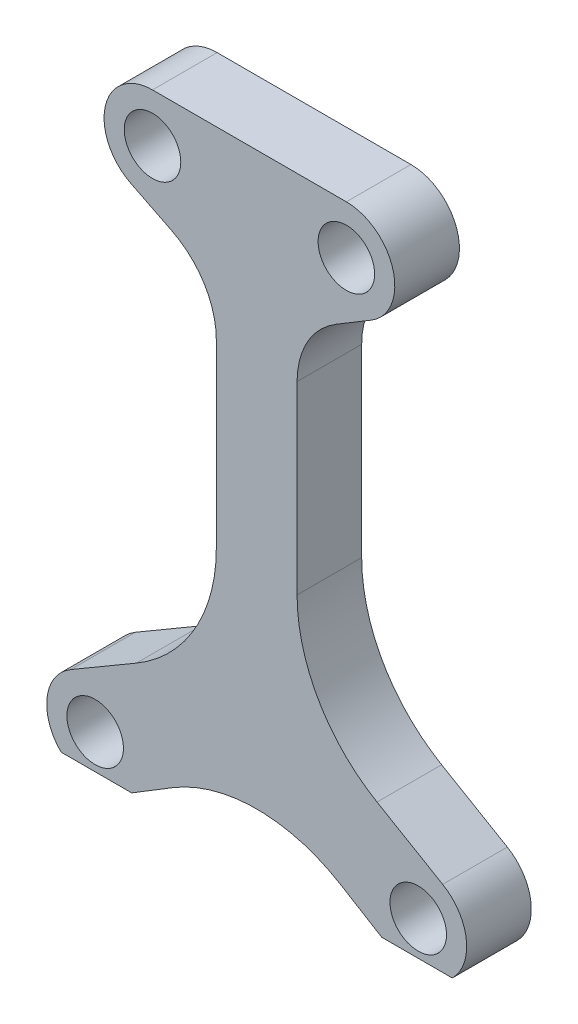
ISO-10303-21;
HEADER;
FILE_DESCRIPTION(('STEP AP214'),'2;1');
FILE_NAME('part.step','',(''),(''),'','','');
FILE_SCHEMA(('AUTOMOTIVE_DESIGN { 1 0 10303 214 1 1 1 1 }'));
ENDSEC;
DATA;
#1=APPLICATION_CONTEXT('core data for automotive mechanical design processes');
#2=APPLICATION_PROTOCOL_DEFINITION('international standard','automotive_design',2000,#1);
#3=PRODUCT_CONTEXT('',#1,'mechanical');
#4=PRODUCT('Part','Part','',(#3));
#5=PRODUCT_RELATED_PRODUCT_CATEGORY('part','',(#4));
#6=PRODUCT_DEFINITION_FORMATION('','',#4);
#7=PRODUCT_DEFINITION_CONTEXT('part definition',#1,'design');
#8=PRODUCT_DEFINITION('design','',#6,#7);
#9=PRODUCT_DEFINITION_SHAPE('','',#8);
#10=(LENGTH_UNIT() NAMED_UNIT(*) SI_UNIT(.MILLI.,.METRE.));
#11=(NAMED_UNIT(*) PLANE_ANGLE_UNIT() SI_UNIT($,.RADIAN.));
#12=(NAMED_UNIT(*) SI_UNIT($,.STERADIAN.) SOLID_ANGLE_UNIT());
#13=UNCERTAINTY_MEASURE_WITH_UNIT(LENGTH_MEASURE(1.E-05),#10,'distance_accuracy_value','');
#14=(GEOMETRIC_REPRESENTATION_CONTEXT(3) GLOBAL_UNCERTAINTY_ASSIGNED_CONTEXT((#13)) GLOBAL_UNIT_ASSIGNED_CONTEXT((#10,
#11,#12)) REPRESENTATION_CONTEXT('',''));
#15=CARTESIAN_POINT('',(0.,0.,0.));
#16=DIRECTION('',(0.,0.,1.));
#17=DIRECTION('',(1.,0.,0.));
#18=AXIS2_PLACEMENT_3D('',#15,#16,#17);
#19=CARTESIAN_POINT('',(0.,0.,4.));
#20=DIRECTION('',(0.,1.,0.));
#21=DIRECTION('',(0.,0.,1.));
#22=AXIS2_PLACEMENT_3D('',#19,#20,#21);
#23=PLANE('',#22);
#24=DIRECTION('',(0.,0.,1.));
#25=VECTOR('',#24,1.);
#26=CARTESIAN_POINT('',(26.1079954434977,0.,0.));
#27=LINE('',#26,#25);
#28=CARTESIAN_POINT('',(26.1079954434977,0.,4.));
#29=VERTEX_POINT('',#28);
#30=CARTESIAN_POINT('',(26.1079954434977,0.,0.));
#31=VERTEX_POINT('',#30);
#32=EDGE_CURVE('E317',#29,#31,#27,.F.);
#33=ORIENTED_EDGE('',*,*,#32,.F.);
#34=DIRECTION('',(1.,0.,0.));
#35=VECTOR('',#34,1.);
#36=CARTESIAN_POINT('',(0.,0.,4.));
#37=LINE('',#36,#35);
#38=CARTESIAN_POINT('',(21.7389056072508,0.,4.));
#39=VERTEX_POINT('',#38);
#40=EDGE_CURVE('E344',#39,#29,#37,.T.);
#41=ORIENTED_EDGE('',*,*,#40,.F.);
#42=DIRECTION('',(0.,0.,1.));
#43=VECTOR('',#42,1.);
#44=CARTESIAN_POINT('',(21.7389056072508,0.,4.));
#45=LINE('',#44,#43);
#46=CARTESIAN_POINT('',(21.7389056072508,0.,0.));
#47=VERTEX_POINT('',#46);
#48=EDGE_CURVE('E315',#47,#39,#45,.T.);
#49=ORIENTED_EDGE('',*,*,#48,.F.);
#50=DIRECTION('',(1.,0.,0.));
#51=VECTOR('',#50,1.);
#52=CARTESIAN_POINT('',(0.,0.,0.));
#53=LINE('',#52,#51);
#54=EDGE_CURVE('E341',#47,#31,#53,.T.);
#55=ORIENTED_EDGE('',*,*,#54,.T.);
#56=EDGE_LOOP('',(#33,#41,#49,#55));
#57=FACE_BOUND('',#56,.T.);
#58=ADVANCED_FACE('F34',(#57),#23,.F.);
#59=DIRECTION('',(0.,0.,-1.));
#60=VECTOR('',#59,1.);
#61=CARTESIAN_POINT('',(6.26109439275633,0.,4.));
#62=LINE('',#61,#60);
#63=CARTESIAN_POINT('',(6.26109439275633,0.,4.));
#64=VERTEX_POINT('',#63);
#65=CARTESIAN_POINT('',(6.26109439275633,0.,0.));
#66=VERTEX_POINT('',#65);
#67=EDGE_CURVE('E56',#64,#66,#62,.T.);
#68=ORIENTED_EDGE('',*,*,#67,.F.);
#69=CARTESIAN_POINT('',(1.89200455651023,0.,4.));
#70=VERTEX_POINT('',#69);
#71=EDGE_CURVE('E347',#70,#64,#37,.T.);
#72=ORIENTED_EDGE('',*,*,#71,.F.);
#73=DIRECTION('',(0.,0.,1.));
#74=VECTOR('',#73,1.);
#75=CARTESIAN_POINT('',(1.89200455651023,0.,0.));
#76=LINE('',#75,#74);
#77=CARTESIAN_POINT('',(1.89200455651023,0.,0.));
#78=VERTEX_POINT('',#77);
#79=EDGE_CURVE('E287',#78,#70,#76,.T.);
#80=ORIENTED_EDGE('',*,*,#79,.F.);
#81=EDGE_CURVE('E348',#78,#66,#53,.T.);
#82=ORIENTED_EDGE('',*,*,#81,.T.);
#83=EDGE_LOOP('',(#68,#72,#80,#82));
#84=FACE_BOUND('',#83,.T.);
#85=ADVANCED_FACE('F358',(#84),#23,.F.);
#86=CARTESIAN_POINT('',(0.,0.,4.));
#87=DIRECTION('',(0.,0.,-1.));
#88=DIRECTION('',(-1.,0.,0.));
#89=AXIS2_PLACEMENT_3D('',#86,#87,#88);
#90=PLANE('',#89);
#91=CARTESIAN_POINT('',(24.0000000000039,2.13456206520436,4.));
#92=DIRECTION('',(0.,0.,1.));
#93=DIRECTION('',(1.,0.,0.));
#94=AXIS2_PLACEMENT_3D('',#91,#92,#93);
#95=CIRCLE('',#94,1.75);
#96=CARTESIAN_POINT('',(25.7500000000039,2.13456206520436,4.));
#97=VERTEX_POINT('',#96);
#98=EDGE_CURVE('E319',#97,#97,#95,.T.);
#99=ORIENTED_EDGE('',*,*,#98,.F.);
#100=EDGE_LOOP('',(#99));
#101=FACE_BOUND('',#100,.T.);
#102=CARTESIAN_POINT('',(4.00000000000394,2.13456206520442,4.));
#103=DIRECTION('',(0.,0.,1.));
#104=DIRECTION('',(1.,0.,0.));
#105=AXIS2_PLACEMENT_3D('',#102,#103,#104);
#106=CIRCLE('',#105,1.75);
#107=CARTESIAN_POINT('',(5.75000000000394,2.13456206520442,4.));
#108=VERTEX_POINT('',#107);
#109=EDGE_CURVE('E330',#108,#108,#106,.T.);
#110=ORIENTED_EDGE('',*,*,#109,.F.);
#111=EDGE_LOOP('',(#110));
#112=FACE_BOUND('',#111,.T.);
#113=CARTESIAN_POINT('',(19.5500000000047,35.3345620650921,4.));
#114=DIRECTION('',(0.,0.,1.));
#115=DIRECTION('',(1.,0.,0.));
#116=AXIS2_PLACEMENT_3D('',#113,#114,#115);
#117=CIRCLE('',#116,1.75);
#118=CARTESIAN_POINT('',(21.3000000000047,35.3345620650921,4.));
#119=VERTEX_POINT('',#118);
#120=EDGE_CURVE('E324',#119,#119,#117,.T.);
#121=ORIENTED_EDGE('',*,*,#120,.F.);
#122=EDGE_LOOP('',(#121));
#123=FACE_BOUND('',#122,.T.);
#124=CARTESIAN_POINT('',(7.55000000000471,35.3345620650921,4.));
#125=DIRECTION('',(0.,0.,1.));
#126=DIRECTION('',(1.,0.,0.));
#127=AXIS2_PLACEMENT_3D('',#124,#125,#126);
#128=CIRCLE('',#127,1.75);
#129=CARTESIAN_POINT('',(9.30000000000471,35.3345620650921,4.));
#130=VERTEX_POINT('',#129);
#131=EDGE_CURVE('E323',#130,#130,#128,.T.);
#132=ORIENTED_EDGE('',*,*,#131,.F.);
#133=EDGE_LOOP('',(#132));
#134=FACE_BOUND('',#133,.T.);
#135=DIRECTION('',(0.853556600559129,-0.521000124416438,0.));
#136=VECTOR('',#135,1.);
#137=CARTESIAN_POINT('',(19.2100012441668,1.54361115237226,4.));
#138=LINE('',#137,#136);
#139=CARTESIAN_POINT('',(19.2100012441668,1.54361115237226,4.));
#140=VERTEX_POINT('',#139);
#141=EDGE_CURVE('E282',#140,#39,#138,.T.);
#142=ORIENTED_EDGE('',*,*,#141,.T.);
#143=ORIENTED_EDGE('',*,*,#40,.T.);
#144=CARTESIAN_POINT('',(24.0000000000039,2.13456206520436,4.));
#145=DIRECTION('',(0.,0.,1.));
#146=DIRECTION('',(1.,0.,0.));
#147=AXIS2_PLACEMENT_3D('',#144,#145,#146);
#148=CIRCLE('',#147,3.);
#149=CARTESIAN_POINT('',(25.51532512477,4.72372984004107,4.));
#150=VERTEX_POINT('',#149);
#151=EDGE_CURVE('E234',#29,#150,#148,.T.);
#152=ORIENTED_EDGE('',*,*,#151,.T.);
#153=DIRECTION('',(-0.863055924945569,0.505108374922004,0.));
#154=VECTOR('',#153,1.);
#155=CARTESIAN_POINT('',(21.44891625078,7.1036186963038,4.));
#156=LINE('',#155,#154);
#157=CARTESIAN_POINT('',(21.44891625078,7.10361869630379,4.));
#158=VERTEX_POINT('',#157);
#159=EDGE_CURVE('E237',#150,#158,#156,.T.);
#160=ORIENTED_EDGE('',*,*,#159,.T.);
#161=CARTESIAN_POINT('',(26.5,15.7341779457595,4.));
#162=DIRECTION('',(0.,0.,-1.));
#163=DIRECTION('',(-1.,0.,0.));
#164=AXIS2_PLACEMENT_3D('',#161,#162,#163);
#165=CIRCLE('',#164,10.);
#166=CARTESIAN_POINT('',(16.5,15.7341779457596,4.));
#167=VERTEX_POINT('',#166);
#168=EDGE_CURVE('E240',#158,#167,#165,.T.);
#169=ORIENTED_EDGE('',*,*,#168,.T.);
#170=DIRECTION('',(0.,1.,0.));
#171=VECTOR('',#170,1.);
#172=CARTESIAN_POINT('',(16.5,27.1722106048025,4.));
#173=LINE('',#172,#171);
#174=CARTESIAN_POINT('',(16.5,27.1722106048025,4.));
#175=VERTEX_POINT('',#174);
#176=EDGE_CURVE('E177',#167,#175,#173,.T.);
#177=ORIENTED_EDGE('',*,*,#176,.T.);
#178=CARTESIAN_POINT('',(21.5,27.1722106048025,4.));
#179=DIRECTION('',(0.,0.,-1.));
#180=DIRECTION('',(1.,0.,0.));
#181=AXIS2_PLACEMENT_3D('',#178,#179,#180);
#182=CIRCLE('',#181,5.);
#183=CARTESIAN_POINT('',(18.9234142491419,31.4572083724187,4.));
#184=VERTEX_POINT('',#183);
#185=EDGE_CURVE('E243',#175,#184,#182,.T.);
#186=ORIENTED_EDGE('',*,*,#185,.T.);
#187=DIRECTION('',(0.856999553523223,0.515317150171617,0.));
#188=VECTOR('',#187,1.);
#189=CARTESIAN_POINT('',(18.9234142491419,31.4572083724187,4.));
#190=LINE('',#189,#188);
#191=CARTESIAN_POINT('',(21.0959514505195,32.7635634045224,4.));
#192=VERTEX_POINT('',#191);
#193=EDGE_CURVE('E246',#184,#192,#190,.T.);
#194=ORIENTED_EDGE('',*,*,#193,.T.);
#195=CARTESIAN_POINT('',(19.5500000000047,35.3345620650921,4.));
#196=DIRECTION('',(0.,0.,1.));
#197=DIRECTION('',(1.,0.,0.));
#198=AXIS2_PLACEMENT_3D('',#195,#196,#197);
#199=CIRCLE('',#198,3.00000000000002);
#200=CARTESIAN_POINT('',(19.5500000000047,38.3345620650921,4.));
#201=VERTEX_POINT('',#200);
#202=EDGE_CURVE('E249',#192,#201,#199,.T.);
#203=ORIENTED_EDGE('',*,*,#202,.T.);
#204=DIRECTION('',(-1.,0.,0.));
#205=VECTOR('',#204,1.);
#206=CARTESIAN_POINT('',(7.55000000000471,38.3345620650921,4.));
#207=LINE('',#206,#205);
#208=CARTESIAN_POINT('',(7.55000000000471,38.3345620650921,4.));
#209=VERTEX_POINT('',#208);
#210=EDGE_CURVE('E252',#201,#209,#207,.T.);
#211=ORIENTED_EDGE('',*,*,#210,.T.);
#212=CARTESIAN_POINT('',(7.55000000000471,35.3345620650921,4.));
#213=DIRECTION('',(0.,0.,1.));
#214=DIRECTION('',(1.,0.,0.));
#215=AXIS2_PLACEMENT_3D('',#212,#213,#214);
#216=CIRCLE('',#215,3.);
#217=CARTESIAN_POINT('',(6.20614608486209,32.6523881977308,4.));
#218=VERTEX_POINT('',#217);
#219=EDGE_CURVE('E255',#209,#218,#216,.T.);
#220=ORIENTED_EDGE('',*,*,#219,.T.);
#221=DIRECTION('',(0.894057955787099,-0.44795130504754,0.));
#222=VECTOR('',#221,1.);
#223=CARTESIAN_POINT('',(6.20614608486209,32.6523881977308,4.));
#224=LINE('',#223,#222);
#225=CARTESIAN_POINT('',(8.73975652523768,31.3829692569317,4.));
#226=VERTEX_POINT('',#225);
#227=EDGE_CURVE('E258',#218,#226,#224,.T.);
#228=ORIENTED_EDGE('',*,*,#227,.T.);
#229=CARTESIAN_POINT('',(6.5,26.9126794779962,4.));
#230=DIRECTION('',(0.,0.,-1.));
#231=DIRECTION('',(1.,0.,0.));
#232=AXIS2_PLACEMENT_3D('',#229,#230,#231);
#233=CIRCLE('',#232,5.);
#234=CARTESIAN_POINT('',(11.5,26.9126794779961,4.));
#235=VERTEX_POINT('',#234);
#236=EDGE_CURVE('E261',#226,#235,#233,.T.);
#237=ORIENTED_EDGE('',*,*,#236,.T.);
#238=DIRECTION('',(0.,-1.,0.));
#239=VECTOR('',#238,1.);
#240=CARTESIAN_POINT('',(11.5,26.9126794779961,4.));
#241=LINE('',#240,#239);
#242=CARTESIAN_POINT('',(11.5,15.7341779457571,4.));
#243=VERTEX_POINT('',#242);
#244=EDGE_CURVE('E264',#235,#243,#241,.T.);
#245=ORIENTED_EDGE('',*,*,#244,.T.);
#246=CARTESIAN_POINT('',(1.5,15.734177945757,4.));
#247=DIRECTION('',(0.,0.,-1.));
#248=DIRECTION('',(-1.,0.,0.));
#249=AXIS2_PLACEMENT_3D('',#246,#247,#248);
#250=CIRCLE('',#249,10.);
#251=CARTESIAN_POINT('',(6.55108374922325,7.1036186963032,4.));
#252=VERTEX_POINT('',#251);
#253=EDGE_CURVE('E267',#243,#252,#250,.T.);
#254=ORIENTED_EDGE('',*,*,#253,.T.);
#255=DIRECTION('',(-0.86305592494538,-0.505108374922328,0.));
#256=VECTOR('',#255,1.);
#257=CARTESIAN_POINT('',(6.55108374922325,7.1036186963032,4.));
#258=LINE('',#257,#256);
#259=CARTESIAN_POINT('',(2.48467487523695,4.72372984004056,4.));
#260=VERTEX_POINT('',#259);
#261=EDGE_CURVE('E270',#252,#260,#258,.T.);
#262=ORIENTED_EDGE('',*,*,#261,.T.);
#263=CARTESIAN_POINT('',(4.00000000000394,2.13456206520442,4.));
#264=DIRECTION('',(0.,0.,1.));
#265=DIRECTION('',(1.,0.,0.));
#266=AXIS2_PLACEMENT_3D('',#263,#264,#265);
#267=CIRCLE('',#266,3.);
#268=EDGE_CURVE('E273',#260,#70,#267,.T.);
#269=ORIENTED_EDGE('',*,*,#268,.T.);
#270=ORIENTED_EDGE('',*,*,#71,.T.);
#271=DIRECTION('',(0.853556600558915,0.521000124416788,0.));
#272=VECTOR('',#271,1.);
#273=CARTESIAN_POINT('',(5.5630003732543,-0.426107736472325,4.));
#274=LINE('',#273,#272);
#275=CARTESIAN_POINT('',(8.78999875583448,1.54361115237013,4.));
#276=VERTEX_POINT('',#275);
#277=EDGE_CURVE('E276',#64,#276,#274,.T.);
#278=ORIENTED_EDGE('',*,*,#277,.T.);
#279=CARTESIAN_POINT('',(14.0000000000024,-6.991954853219,4.));
#280=DIRECTION('',(0.,0.,-1.));
#281=DIRECTION('',(-1.,0.,0.));
#282=AXIS2_PLACEMENT_3D('',#279,#280,#281);
#283=CIRCLE('',#282,10.);
#284=EDGE_CURVE('E279',#276,#140,#283,.T.);
#285=ORIENTED_EDGE('',*,*,#284,.T.);
#286=EDGE_LOOP('',(#142,#143,#152,#160,#169,#177,#186,#194,#203,#211,#220,#228,#237,#245,#254,
#262,#269,#270,#278,#285));
#287=FACE_BOUND('',#286,.T.);
#288=ADVANCED_FACE('F354',(#101,#112,#123,#134,#287),#90,.F.);
#289=CARTESIAN_POINT('',(0.,0.,0.));
#290=DIRECTION('',(0.,0.,-1.));
#291=DIRECTION('',(-1.,0.,0.));
#292=AXIS2_PLACEMENT_3D('',#289,#290,#291);
#293=PLANE('',#292);
#294=CARTESIAN_POINT('',(24.0000000000039,2.13456206520436,0.));
#295=DIRECTION('',(0.,0.,1.));
#296=DIRECTION('',(1.,0.,0.));
#297=AXIS2_PLACEMENT_3D('',#294,#295,#296);
#298=CIRCLE('',#297,1.75);
#299=CARTESIAN_POINT('',(25.7500000000039,2.13456206520436,0.));
#300=VERTEX_POINT('',#299);
#301=EDGE_CURVE('E333',#300,#300,#298,.T.);
#302=ORIENTED_EDGE('',*,*,#301,.T.);
#303=EDGE_LOOP('',(#302));
#304=FACE_BOUND('',#303,.T.);
#305=CARTESIAN_POINT('',(4.00000000000394,2.13456206520442,0.));
#306=DIRECTION('',(0.,0.,1.));
#307=DIRECTION('',(1.,0.,0.));
#308=AXIS2_PLACEMENT_3D('',#305,#306,#307);
#309=CIRCLE('',#308,1.75);
#310=CARTESIAN_POINT('',(5.75000000000394,2.13456206520442,0.));
#311=VERTEX_POINT('',#310);
#312=EDGE_CURVE('E327',#311,#311,#309,.T.);
#313=ORIENTED_EDGE('',*,*,#312,.T.);
#314=EDGE_LOOP('',(#313));
#315=FACE_BOUND('',#314,.T.);
#316=CARTESIAN_POINT('',(19.5500000000047,35.3345620650921,0.));
#317=DIRECTION('',(0.,0.,1.));
#318=DIRECTION('',(1.,0.,0.));
#319=AXIS2_PLACEMENT_3D('',#316,#317,#318);
#320=CIRCLE('',#319,1.75);
#321=CARTESIAN_POINT('',(21.3000000000047,35.3345620650921,0.));
#322=VERTEX_POINT('',#321);
#323=EDGE_CURVE('E320',#322,#322,#320,.T.);
#324=ORIENTED_EDGE('',*,*,#323,.T.);
#325=EDGE_LOOP('',(#324));
#326=FACE_BOUND('',#325,.T.);
#327=CARTESIAN_POINT('',(7.55000000000471,35.3345620650921,0.));
#328=DIRECTION('',(0.,0.,1.));
#329=DIRECTION('',(1.,0.,0.));
#330=AXIS2_PLACEMENT_3D('',#327,#328,#329);
#331=CIRCLE('',#330,1.75);
#332=CARTESIAN_POINT('',(9.30000000000471,35.3345620650921,0.));
#333=VERTEX_POINT('',#332);
#334=EDGE_CURVE('E338',#333,#333,#331,.T.);
#335=ORIENTED_EDGE('',*,*,#334,.T.);
#336=EDGE_LOOP('',(#335));
#337=FACE_BOUND('',#336,.T.);
#338=ORIENTED_EDGE('',*,*,#54,.F.);
#339=DIRECTION('',(0.853556600559129,-0.521000124416438,0.));
#340=VECTOR('',#339,1.);
#341=CARTESIAN_POINT('',(19.2100012441668,1.54361115237226,0.));
#342=LINE('',#341,#340);
#343=CARTESIAN_POINT('',(19.2100012441668,1.54361115237226,0.));
#344=VERTEX_POINT('',#343);
#345=EDGE_CURVE('E232',#344,#47,#342,.T.);
#346=ORIENTED_EDGE('',*,*,#345,.F.);
#347=CARTESIAN_POINT('',(14.0000000000024,-6.991954853219,0.));
#348=DIRECTION('',(0.,0.,-1.));
#349=DIRECTION('',(-1.,0.,0.));
#350=AXIS2_PLACEMENT_3D('',#347,#348,#349);
#351=CIRCLE('',#350,10.);
#352=CARTESIAN_POINT('',(8.78999875583448,1.54361115237013,0.));
#353=VERTEX_POINT('',#352);
#354=EDGE_CURVE('E229',#353,#344,#351,.T.);
#355=ORIENTED_EDGE('',*,*,#354,.F.);
#356=DIRECTION('',(-0.853556600558915,-0.521000124416788,0.));
#357=VECTOR('',#356,1.);
#358=CARTESIAN_POINT('',(1.6995185347669,-2.78432805509664,0.));
#359=LINE('',#358,#357);
#360=EDGE_CURVE('E11',#353,#66,#359,.T.);
#361=ORIENTED_EDGE('',*,*,#360,.T.);
#362=ORIENTED_EDGE('',*,*,#81,.F.);
#363=CARTESIAN_POINT('',(4.00000000000394,2.13456206520442,0.));
#364=DIRECTION('',(0.,0.,1.));
#365=DIRECTION('',(1.,0.,0.));
#366=AXIS2_PLACEMENT_3D('',#363,#364,#365);
#367=CIRCLE('',#366,3.);
#368=CARTESIAN_POINT('',(2.48467487523695,4.72372984004056,0.));
#369=VERTEX_POINT('',#368);
#370=EDGE_CURVE('E227',#369,#78,#367,.T.);
#371=ORIENTED_EDGE('',*,*,#370,.F.);
#372=DIRECTION('',(-0.86305592494538,-0.505108374922328,0.));
#373=VECTOR('',#372,1.);
#374=CARTESIAN_POINT('',(6.55108374922325,7.1036186963032,0.));
#375=LINE('',#374,#373);
#376=CARTESIAN_POINT('',(6.55108374922325,7.1036186963032,0.));
#377=VERTEX_POINT('',#376);
#378=EDGE_CURVE('E224',#377,#369,#375,.T.);
#379=ORIENTED_EDGE('',*,*,#378,.F.);
#380=CARTESIAN_POINT('',(1.5,15.734177945757,0.));
#381=DIRECTION('',(0.,0.,-1.));
#382=DIRECTION('',(-1.,0.,0.));
#383=AXIS2_PLACEMENT_3D('',#380,#381,#382);
#384=CIRCLE('',#383,10.);
#385=CARTESIAN_POINT('',(11.5,15.7341779457571,0.));
#386=VERTEX_POINT('',#385);
#387=EDGE_CURVE('E221',#386,#377,#384,.T.);
#388=ORIENTED_EDGE('',*,*,#387,.F.);
#389=DIRECTION('',(0.,-1.,0.));
#390=VECTOR('',#389,1.);
#391=CARTESIAN_POINT('',(11.5,26.9126794779961,0.));
#392=LINE('',#391,#390);
#393=CARTESIAN_POINT('',(11.5,26.9126794779961,0.));
#394=VERTEX_POINT('',#393);
#395=EDGE_CURVE('E218',#394,#386,#392,.T.);
#396=ORIENTED_EDGE('',*,*,#395,.F.);
#397=CARTESIAN_POINT('',(6.5,26.9126794779962,0.));
#398=DIRECTION('',(0.,0.,-1.));
#399=DIRECTION('',(1.,0.,0.));
#400=AXIS2_PLACEMENT_3D('',#397,#398,#399);
#401=CIRCLE('',#400,5.);
#402=CARTESIAN_POINT('',(8.73975652523768,31.3829692569317,0.));
#403=VERTEX_POINT('',#402);
#404=EDGE_CURVE('E215',#403,#394,#401,.T.);
#405=ORIENTED_EDGE('',*,*,#404,.F.);
#406=DIRECTION('',(0.894057955787099,-0.44795130504754,0.));
#407=VECTOR('',#406,1.);
#408=CARTESIAN_POINT('',(6.20614608486209,32.6523881977308,0.));
#409=LINE('',#408,#407);
#410=CARTESIAN_POINT('',(6.20614608486209,32.6523881977308,0.));
#411=VERTEX_POINT('',#410);
#412=EDGE_CURVE('E212',#411,#403,#409,.T.);
#413=ORIENTED_EDGE('',*,*,#412,.F.);
#414=CARTESIAN_POINT('',(7.55000000000471,35.3345620650921,0.));
#415=DIRECTION('',(0.,0.,1.));
#416=DIRECTION('',(1.,0.,0.));
#417=AXIS2_PLACEMENT_3D('',#414,#415,#416);
#418=CIRCLE('',#417,3.);
#419=CARTESIAN_POINT('',(7.55000000000471,38.3345620650921,0.));
#420=VERTEX_POINT('',#419);
#421=EDGE_CURVE('E209',#420,#411,#418,.T.);
#422=ORIENTED_EDGE('',*,*,#421,.F.);
#423=DIRECTION('',(-1.,0.,0.));
#424=VECTOR('',#423,1.);
#425=CARTESIAN_POINT('',(7.55000000000471,38.3345620650921,0.));
#426=LINE('',#425,#424);
#427=CARTESIAN_POINT('',(19.5500000000047,38.3345620650921,0.));
#428=VERTEX_POINT('',#427);
#429=EDGE_CURVE('E206',#428,#420,#426,.T.);
#430=ORIENTED_EDGE('',*,*,#429,.F.);
#431=CARTESIAN_POINT('',(19.5500000000047,35.3345620650921,0.));
#432=DIRECTION('',(0.,0.,1.));
#433=DIRECTION('',(1.,0.,0.));
#434=AXIS2_PLACEMENT_3D('',#431,#432,#433);
#435=CIRCLE('',#434,3.00000000000002);
#436=CARTESIAN_POINT('',(21.0959514505195,32.7635634045224,0.));
#437=VERTEX_POINT('',#436);
#438=EDGE_CURVE('E203',#437,#428,#435,.T.);
#439=ORIENTED_EDGE('',*,*,#438,.F.);
#440=DIRECTION('',(0.856999553523223,0.515317150171617,0.));
#441=VECTOR('',#440,1.);
#442=CARTESIAN_POINT('',(18.9234142491419,31.4572083724187,0.));
#443=LINE('',#442,#441);
#444=CARTESIAN_POINT('',(18.9234142491419,31.4572083724187,0.));
#445=VERTEX_POINT('',#444);
#446=EDGE_CURVE('E197',#445,#437,#443,.T.);
#447=ORIENTED_EDGE('',*,*,#446,.F.);
#448=CARTESIAN_POINT('',(21.5,27.1722106048025,0.));
#449=DIRECTION('',(0.,0.,-1.));
#450=DIRECTION('',(1.,0.,0.));
#451=AXIS2_PLACEMENT_3D('',#448,#449,#450);
#452=CIRCLE('',#451,5.);
#453=CARTESIAN_POINT('',(16.5,27.1722106048025,0.));
#454=VERTEX_POINT('',#453);
#455=EDGE_CURVE('E195',#454,#445,#452,.T.);
#456=ORIENTED_EDGE('',*,*,#455,.F.);
#457=DIRECTION('',(0.,1.,0.));
#458=VECTOR('',#457,1.);
#459=CARTESIAN_POINT('',(16.5,27.1722106048025,0.));
#460=LINE('',#459,#458);
#461=CARTESIAN_POINT('',(16.5,15.7341779457596,0.));
#462=VERTEX_POINT('',#461);
#463=EDGE_CURVE('E174',#462,#454,#460,.T.);
#464=ORIENTED_EDGE('',*,*,#463,.F.);
#465=CARTESIAN_POINT('',(26.5,15.7341779457595,0.));
#466=DIRECTION('',(0.,0.,-1.));
#467=DIRECTION('',(-1.,0.,0.));
#468=AXIS2_PLACEMENT_3D('',#465,#466,#467);
#469=CIRCLE('',#468,10.);
#470=CARTESIAN_POINT('',(21.44891625078,7.1036186963038,0.));
#471=VERTEX_POINT('',#470);
#472=EDGE_CURVE('E185',#471,#462,#469,.T.);
#473=ORIENTED_EDGE('',*,*,#472,.F.);
#474=DIRECTION('',(-0.863055924945569,0.505108374922004,0.));
#475=VECTOR('',#474,1.);
#476=CARTESIAN_POINT('',(21.44891625078,7.1036186963038,0.));
#477=LINE('',#476,#475);
#478=CARTESIAN_POINT('',(25.51532512477,4.72372984004107,0.));
#479=VERTEX_POINT('',#478);
#480=EDGE_CURVE('E189',#479,#471,#477,.T.);
#481=ORIENTED_EDGE('',*,*,#480,.F.);
#482=CARTESIAN_POINT('',(24.0000000000039,2.13456206520436,0.));
#483=DIRECTION('',(0.,0.,-1.));
#484=DIRECTION('',(-1.,0.,0.));
#485=AXIS2_PLACEMENT_3D('',#482,#483,#484);
#486=CIRCLE('',#485,3.);
#487=EDGE_CURVE('E41',#479,#31,#486,.T.);
#488=ORIENTED_EDGE('',*,*,#487,.T.);
#489=EDGE_LOOP('',(#338,#346,#355,#361,#362,#371,#379,#388,#396,#405,#413,#422,#430,#439,#447,
#456,#464,#473,#481,#488));
#490=FACE_BOUND('',#489,.T.);
#491=ADVANCED_FACE('F192',(#304,#315,#326,#337,#490),#293,.T.);
#492=CARTESIAN_POINT('',(7.55000000000471,35.3345620650921,0.));
#493=DIRECTION('',(0.,0.,1.));
#494=DIRECTION('',(1.,0.,0.));
#495=AXIS2_PLACEMENT_3D('',#492,#493,#494);
#496=CYLINDRICAL_SURFACE('',#495,1.75);
#497=ORIENTED_EDGE('',*,*,#334,.F.);
#498=EDGE_LOOP('',(#497));
#499=FACE_BOUND('',#498,.T.);
#500=ORIENTED_EDGE('',*,*,#131,.T.);
#501=EDGE_LOOP('',(#500));
#502=FACE_BOUND('',#501,.T.);
#503=ADVANCED_FACE('F403',(#499,#502),#496,.F.);
#504=CARTESIAN_POINT('',(19.5500000000047,35.3345620650921,0.));
#505=DIRECTION('',(0.,0.,1.));
#506=DIRECTION('',(1.,0.,0.));
#507=AXIS2_PLACEMENT_3D('',#504,#505,#506);
#508=CYLINDRICAL_SURFACE('',#507,1.75);
#509=ORIENTED_EDGE('',*,*,#323,.F.);
#510=EDGE_LOOP('',(#509));
#511=FACE_BOUND('',#510,.T.);
#512=ORIENTED_EDGE('',*,*,#120,.T.);
#513=EDGE_LOOP('',(#512));
#514=FACE_BOUND('',#513,.T.);
#515=ADVANCED_FACE('F409',(#511,#514),#508,.F.);
#516=CARTESIAN_POINT('',(4.00000000000394,2.13456206520442,0.));
#517=DIRECTION('',(0.,0.,1.));
#518=DIRECTION('',(1.,0.,0.));
#519=AXIS2_PLACEMENT_3D('',#516,#517,#518);
#520=CYLINDRICAL_SURFACE('',#519,1.75);
#521=ORIENTED_EDGE('',*,*,#312,.F.);
#522=EDGE_LOOP('',(#521));
#523=FACE_BOUND('',#522,.T.);
#524=ORIENTED_EDGE('',*,*,#109,.T.);
#525=EDGE_LOOP('',(#524));
#526=FACE_BOUND('',#525,.T.);
#527=ADVANCED_FACE('F387',(#523,#526),#520,.F.);
#528=CARTESIAN_POINT('',(24.0000000000039,2.13456206520436,0.));
#529=DIRECTION('',(0.,0.,1.));
#530=DIRECTION('',(1.,0.,0.));
#531=AXIS2_PLACEMENT_3D('',#528,#529,#530);
#532=CYLINDRICAL_SURFACE('',#531,1.75);
#533=ORIENTED_EDGE('',*,*,#301,.F.);
#534=EDGE_LOOP('',(#533));
#535=FACE_BOUND('',#534,.T.);
#536=ORIENTED_EDGE('',*,*,#98,.T.);
#537=EDGE_LOOP('',(#536));
#538=FACE_BOUND('',#537,.T.);
#539=ADVANCED_FACE('F380',(#535,#538),#532,.F.);
#540=CARTESIAN_POINT('',(21.44891625078,7.1036186963038,0.));
#541=DIRECTION('',(0.505108374922004,0.863055924945569,0.));
#542=DIRECTION('',(-0.863055924945569,0.505108374922004,0.));
#543=AXIS2_PLACEMENT_3D('',#540,#541,#542);
#544=PLANE('',#543);
#545=ORIENTED_EDGE('',*,*,#159,.F.);
#546=DIRECTION('',(0.,0.,1.));
#547=VECTOR('',#546,1.);
#548=CARTESIAN_POINT('',(25.51532512477,4.72372984004107,0.));
#549=LINE('',#548,#547);
#550=EDGE_CURVE('E48',#479,#150,#549,.T.);
#551=ORIENTED_EDGE('',*,*,#550,.F.);
#552=ORIENTED_EDGE('',*,*,#480,.T.);
#553=DIRECTION('',(0.,0.,1.));
#554=VECTOR('',#553,1.);
#555=CARTESIAN_POINT('',(21.44891625078,7.10361869630379,0.));
#556=LINE('',#555,#554);
#557=EDGE_CURVE('E182',#471,#158,#556,.T.);
#558=ORIENTED_EDGE('',*,*,#557,.T.);
#559=EDGE_LOOP('',(#545,#551,#552,#558));
#560=FACE_BOUND('',#559,.T.);
#561=ADVANCED_FACE('F378',(#560),#544,.T.);
#562=CARTESIAN_POINT('',(26.5,15.7341779457595,0.));
#563=DIRECTION('',(0.,0.,1.));
#564=DIRECTION('',(1.,0.,0.));
#565=AXIS2_PLACEMENT_3D('',#562,#563,#564);
#566=CYLINDRICAL_SURFACE('',#565,10.);
#567=ORIENTED_EDGE('',*,*,#168,.F.);
#568=ORIENTED_EDGE('',*,*,#557,.F.);
#569=ORIENTED_EDGE('',*,*,#472,.T.);
#570=DIRECTION('',(0.,0.,1.));
#571=VECTOR('',#570,1.);
#572=CARTESIAN_POINT('',(16.5,15.7341779457596,0.));
#573=LINE('',#572,#571);
#574=EDGE_CURVE('E170',#462,#167,#573,.T.);
#575=ORIENTED_EDGE('',*,*,#574,.T.);
#576=EDGE_LOOP('',(#567,#568,#569,#575));
#577=FACE_BOUND('',#576,.T.);
#578=ADVANCED_FACE('F186',(#577),#566,.F.);
#579=CARTESIAN_POINT('',(16.5,27.1722106048025,0.));
#580=DIRECTION('',(1.,0.,0.));
#581=DIRECTION('',(0.,0.,-1.));
#582=AXIS2_PLACEMENT_3D('',#579,#580,#581);
#583=PLANE('',#582);
#584=ORIENTED_EDGE('',*,*,#176,.F.);
#585=ORIENTED_EDGE('',*,*,#574,.F.);
#586=ORIENTED_EDGE('',*,*,#463,.T.);
#587=DIRECTION('',(0.,0.,1.));
#588=VECTOR('',#587,1.);
#589=CARTESIAN_POINT('',(16.5,27.1722106048025,0.));
#590=LINE('',#589,#588);
#591=EDGE_CURVE('E181',#454,#175,#590,.T.);
#592=ORIENTED_EDGE('',*,*,#591,.T.);
#593=EDGE_LOOP('',(#584,#585,#586,#592));
#594=FACE_BOUND('',#593,.T.);
#595=ADVANCED_FACE('F172',(#594),#583,.T.);
#596=CARTESIAN_POINT('',(21.5,27.1722106048025,0.));
#597=DIRECTION('',(0.,0.,1.));
#598=DIRECTION('',(1.,0.,0.));
#599=AXIS2_PLACEMENT_3D('',#596,#597,#598);
#600=CYLINDRICAL_SURFACE('',#599,5.);
#601=ORIENTED_EDGE('',*,*,#185,.F.);
#602=ORIENTED_EDGE('',*,*,#591,.F.);
#603=ORIENTED_EDGE('',*,*,#455,.T.);
#604=DIRECTION('',(0.,0.,1.));
#605=VECTOR('',#604,1.);
#606=CARTESIAN_POINT('',(18.9234142491419,31.4572083724187,0.));
#607=LINE('',#606,#605);
#608=EDGE_CURVE('E308',#445,#184,#607,.T.);
#609=ORIENTED_EDGE('',*,*,#608,.T.);
#610=EDGE_LOOP('',(#601,#602,#603,#609));
#611=FACE_BOUND('',#610,.T.);
#612=ADVANCED_FACE('F467',(#611),#600,.F.);
#613=CARTESIAN_POINT('',(18.9234142491419,31.4572083724187,0.));
#614=DIRECTION('',(0.515317150171617,-0.856999553523223,0.));
#615=DIRECTION('',(0.856999553523223,0.515317150171617,0.));
#616=AXIS2_PLACEMENT_3D('',#613,#614,#615);
#617=PLANE('',#616);
#618=ORIENTED_EDGE('',*,*,#193,.F.);
#619=ORIENTED_EDGE('',*,*,#608,.F.);
#620=ORIENTED_EDGE('',*,*,#446,.T.);
#621=DIRECTION('',(0.,0.,1.));
#622=VECTOR('',#621,1.);
#623=CARTESIAN_POINT('',(21.0959514505195,32.7635634045224,0.));
#624=LINE('',#623,#622);
#625=EDGE_CURVE('E306',#437,#192,#624,.T.);
#626=ORIENTED_EDGE('',*,*,#625,.T.);
#627=EDGE_LOOP('',(#618,#619,#620,#626));
#628=FACE_BOUND('',#627,.T.);
#629=ADVANCED_FACE('F463',(#628),#617,.T.);
#630=CARTESIAN_POINT('',(19.5500000000047,35.3345620650921,0.));
#631=DIRECTION('',(0.,0.,1.));
#632=DIRECTION('',(1.,0.,0.));
#633=AXIS2_PLACEMENT_3D('',#630,#631,#632);
#634=CYLINDRICAL_SURFACE('',#633,3.00000000000002);
#635=ORIENTED_EDGE('',*,*,#202,.F.);
#636=ORIENTED_EDGE('',*,*,#625,.F.);
#637=ORIENTED_EDGE('',*,*,#438,.T.);
#638=DIRECTION('',(0.,0.,1.));
#639=VECTOR('',#638,1.);
#640=CARTESIAN_POINT('',(19.5500000000047,38.3345620650921,0.));
#641=LINE('',#640,#639);
#642=EDGE_CURVE('E304',#428,#201,#641,.T.);
#643=ORIENTED_EDGE('',*,*,#642,.T.);
#644=EDGE_LOOP('',(#635,#636,#637,#643));
#645=FACE_BOUND('',#644,.T.);
#646=ADVANCED_FACE('F459',(#645),#634,.T.);
#647=CARTESIAN_POINT('',(7.55000000000471,38.3345620650921,0.));
#648=DIRECTION('',(0.,1.,0.));
#649=DIRECTION('',(0.,0.,1.));
#650=AXIS2_PLACEMENT_3D('',#647,#648,#649);
#651=PLANE('',#650);
#652=ORIENTED_EDGE('',*,*,#210,.F.);
#653=ORIENTED_EDGE('',*,*,#642,.F.);
#654=ORIENTED_EDGE('',*,*,#429,.T.);
#655=DIRECTION('',(0.,0.,1.));
#656=VECTOR('',#655,1.);
#657=CARTESIAN_POINT('',(7.55000000000471,38.3345620650921,0.));
#658=LINE('',#657,#656);
#659=EDGE_CURVE('E302',#420,#209,#658,.T.);
#660=ORIENTED_EDGE('',*,*,#659,.T.);
#661=EDGE_LOOP('',(#652,#653,#654,#660));
#662=FACE_BOUND('',#661,.T.);
#663=ADVANCED_FACE('F455',(#662),#651,.T.);
#664=CARTESIAN_POINT('',(7.55000000000471,35.3345620650921,0.));
#665=DIRECTION('',(0.,0.,1.));
#666=DIRECTION('',(1.,0.,0.));
#667=AXIS2_PLACEMENT_3D('',#664,#665,#666);
#668=CYLINDRICAL_SURFACE('',#667,3.);
#669=ORIENTED_EDGE('',*,*,#219,.F.);
#670=ORIENTED_EDGE('',*,*,#659,.F.);
#671=ORIENTED_EDGE('',*,*,#421,.T.);
#672=DIRECTION('',(0.,0.,1.));
#673=VECTOR('',#672,1.);
#674=CARTESIAN_POINT('',(6.20614608486209,32.6523881977308,0.));
#675=LINE('',#674,#673);
#676=EDGE_CURVE('E300',#411,#218,#675,.T.);
#677=ORIENTED_EDGE('',*,*,#676,.T.);
#678=EDGE_LOOP('',(#669,#670,#671,#677));
#679=FACE_BOUND('',#678,.T.);
#680=ADVANCED_FACE('F451',(#679),#668,.T.);
#681=CARTESIAN_POINT('',(6.20614608486209,32.6523881977308,0.));
#682=DIRECTION('',(-0.44795130504754,-0.894057955787099,0.));
#683=DIRECTION('',(0.894057955787099,-0.44795130504754,0.));
#684=AXIS2_PLACEMENT_3D('',#681,#682,#683);
#685=PLANE('',#684);
#686=ORIENTED_EDGE('',*,*,#227,.F.);
#687=ORIENTED_EDGE('',*,*,#676,.F.);
#688=ORIENTED_EDGE('',*,*,#412,.T.);
#689=DIRECTION('',(0.,0.,1.));
#690=VECTOR('',#689,1.);
#691=CARTESIAN_POINT('',(8.73975652523768,31.3829692569317,0.));
#692=LINE('',#691,#690);
#693=EDGE_CURVE('E298',#403,#226,#692,.T.);
#694=ORIENTED_EDGE('',*,*,#693,.T.);
#695=EDGE_LOOP('',(#686,#687,#688,#694));
#696=FACE_BOUND('',#695,.T.);
#697=ADVANCED_FACE('F447',(#696),#685,.T.);
#698=CARTESIAN_POINT('',(6.5,26.9126794779962,0.));
#699=DIRECTION('',(0.,0.,1.));
#700=DIRECTION('',(1.,0.,0.));
#701=AXIS2_PLACEMENT_3D('',#698,#699,#700);
#702=CYLINDRICAL_SURFACE('',#701,5.);
#703=ORIENTED_EDGE('',*,*,#236,.F.);
#704=ORIENTED_EDGE('',*,*,#693,.F.);
#705=ORIENTED_EDGE('',*,*,#404,.T.);
#706=DIRECTION('',(0.,0.,1.));
#707=VECTOR('',#706,1.);
#708=CARTESIAN_POINT('',(11.5,26.9126794779961,0.));
#709=LINE('',#708,#707);
#710=EDGE_CURVE('E296',#394,#235,#709,.T.);
#711=ORIENTED_EDGE('',*,*,#710,.T.);
#712=EDGE_LOOP('',(#703,#704,#705,#711));
#713=FACE_BOUND('',#712,.T.);
#714=ADVANCED_FACE('F443',(#713),#702,.F.);
#715=CARTESIAN_POINT('',(11.5,26.9126794779961,0.));
#716=DIRECTION('',(-1.,0.,0.));
#717=DIRECTION('',(0.,-1.,0.));
#718=AXIS2_PLACEMENT_3D('',#715,#716,#717);
#719=PLANE('',#718);
#720=ORIENTED_EDGE('',*,*,#244,.F.);
#721=ORIENTED_EDGE('',*,*,#710,.F.);
#722=ORIENTED_EDGE('',*,*,#395,.T.);
#723=DIRECTION('',(0.,0.,1.));
#724=VECTOR('',#723,1.);
#725=CARTESIAN_POINT('',(11.5,15.7341779457571,0.));
#726=LINE('',#725,#724);
#727=EDGE_CURVE('E294',#386,#243,#726,.T.);
#728=ORIENTED_EDGE('',*,*,#727,.T.);
#729=EDGE_LOOP('',(#720,#721,#722,#728));
#730=FACE_BOUND('',#729,.T.);
#731=ADVANCED_FACE('F439',(#730),#719,.T.);
#732=CARTESIAN_POINT('',(1.5,15.734177945757,0.));
#733=DIRECTION('',(0.,0.,1.));
#734=DIRECTION('',(1.,0.,0.));
#735=AXIS2_PLACEMENT_3D('',#732,#733,#734);
#736=CYLINDRICAL_SURFACE('',#735,10.);
#737=ORIENTED_EDGE('',*,*,#253,.F.);
#738=ORIENTED_EDGE('',*,*,#727,.F.);
#739=ORIENTED_EDGE('',*,*,#387,.T.);
#740=DIRECTION('',(0.,0.,1.));
#741=VECTOR('',#740,1.);
#742=CARTESIAN_POINT('',(6.55108374922325,7.1036186963032,0.));
#743=LINE('',#742,#741);
#744=EDGE_CURVE('E292',#377,#252,#743,.T.);
#745=ORIENTED_EDGE('',*,*,#744,.T.);
#746=EDGE_LOOP('',(#737,#738,#739,#745));
#747=FACE_BOUND('',#746,.T.);
#748=ADVANCED_FACE('F431',(#747),#736,.F.);
#749=CARTESIAN_POINT('',(6.55108374922325,7.1036186963032,0.));
#750=DIRECTION('',(-0.505108374922328,0.86305592494538,0.));
#751=DIRECTION('',(-0.86305592494538,-0.505108374922328,0.));
#752=AXIS2_PLACEMENT_3D('',#749,#750,#751);
#753=PLANE('',#752);
#754=ORIENTED_EDGE('',*,*,#261,.F.);
#755=ORIENTED_EDGE('',*,*,#744,.F.);
#756=ORIENTED_EDGE('',*,*,#378,.T.);
#757=DIRECTION('',(0.,0.,1.));
#758=VECTOR('',#757,1.);
#759=CARTESIAN_POINT('',(2.48467487523695,4.72372984004056,0.));
#760=LINE('',#759,#758);
#761=EDGE_CURVE('E290',#369,#260,#760,.T.);
#762=ORIENTED_EDGE('',*,*,#761,.T.);
#763=EDGE_LOOP('',(#754,#755,#756,#762));
#764=FACE_BOUND('',#763,.T.);
#765=ADVANCED_FACE('F425',(#764),#753,.T.);
#766=CARTESIAN_POINT('',(4.00000000000394,2.13456206520442,0.));
#767=DIRECTION('',(0.,0.,1.));
#768=DIRECTION('',(1.,0.,0.));
#769=AXIS2_PLACEMENT_3D('',#766,#767,#768);
#770=CYLINDRICAL_SURFACE('',#769,3.);
#771=ORIENTED_EDGE('',*,*,#79,.T.);
#772=ORIENTED_EDGE('',*,*,#268,.F.);
#773=ORIENTED_EDGE('',*,*,#761,.F.);
#774=ORIENTED_EDGE('',*,*,#370,.T.);
#775=EDGE_LOOP('',(#771,#772,#773,#774));
#776=FACE_BOUND('',#775,.T.);
#777=ADVANCED_FACE('F419',(#776),#770,.T.);
#778=CARTESIAN_POINT('',(24.0000000000039,2.13456206520436,0.));
#779=DIRECTION('',(0.,0.,1.));
#780=DIRECTION('',(1.,0.,0.));
#781=AXIS2_PLACEMENT_3D('',#778,#779,#780);
#782=CYLINDRICAL_SURFACE('',#781,3.);
#783=ORIENTED_EDGE('',*,*,#32,.T.);
#784=ORIENTED_EDGE('',*,*,#487,.F.);
#785=ORIENTED_EDGE('',*,*,#550,.T.);
#786=ORIENTED_EDGE('',*,*,#151,.F.);
#787=EDGE_LOOP('',(#783,#784,#785,#786));
#788=FACE_BOUND('',#787,.T.);
#789=ADVANCED_FACE('F377',(#788),#782,.T.);
#790=CARTESIAN_POINT('',(19.2100012441668,1.54361115237226,0.));
#791=DIRECTION('',(-0.521000124416438,-0.853556600559129,0.));
#792=DIRECTION('',(0.853556600559129,-0.521000124416438,0.));
#793=AXIS2_PLACEMENT_3D('',#790,#791,#792);
#794=PLANE('',#793);
#795=ORIENTED_EDGE('',*,*,#48,.T.);
#796=ORIENTED_EDGE('',*,*,#141,.F.);
#797=DIRECTION('',(0.,0.,1.));
#798=VECTOR('',#797,1.);
#799=CARTESIAN_POINT('',(19.2100012441668,1.54361115237226,0.));
#800=LINE('',#799,#798);
#801=EDGE_CURVE('E285',#344,#140,#800,.T.);
#802=ORIENTED_EDGE('',*,*,#801,.F.);
#803=ORIENTED_EDGE('',*,*,#345,.T.);
#804=EDGE_LOOP('',(#795,#796,#802,#803));
#805=FACE_BOUND('',#804,.T.);
#806=ADVANCED_FACE('F418',(#805),#794,.T.);
#807=CARTESIAN_POINT('',(5.5630003732543,-0.426107736472325,0.));
#808=DIRECTION('',(0.521000124416788,-0.853556600558915,0.));
#809=DIRECTION('',(0.853556600558915,0.521000124416788,0.));
#810=AXIS2_PLACEMENT_3D('',#807,#808,#809);
#811=PLANE('',#810);
#812=ORIENTED_EDGE('',*,*,#67,.T.);
#813=ORIENTED_EDGE('',*,*,#360,.F.);
#814=DIRECTION('',(0.,0.,1.));
#815=VECTOR('',#814,1.);
#816=CARTESIAN_POINT('',(8.78999875583448,1.54361115237013,0.));
#817=LINE('',#816,#815);
#818=EDGE_CURVE('E288',#353,#276,#817,.T.);
#819=ORIENTED_EDGE('',*,*,#818,.T.);
#820=ORIENTED_EDGE('',*,*,#277,.F.);
#821=EDGE_LOOP('',(#812,#813,#819,#820));
#822=FACE_BOUND('',#821,.T.);
#823=ADVANCED_FACE('F366',(#822),#811,.T.);
#824=CARTESIAN_POINT('',(14.0000000000024,-6.991954853219,0.));
#825=DIRECTION('',(0.,0.,1.));
#826=DIRECTION('',(1.,0.,0.));
#827=AXIS2_PLACEMENT_3D('',#824,#825,#826);
#828=CYLINDRICAL_SURFACE('',#827,10.);
#829=ORIENTED_EDGE('',*,*,#284,.F.);
#830=ORIENTED_EDGE('',*,*,#818,.F.);
#831=ORIENTED_EDGE('',*,*,#354,.T.);
#832=ORIENTED_EDGE('',*,*,#801,.T.);
#833=EDGE_LOOP('',(#829,#830,#831,#832));
#834=FACE_BOUND('',#833,.T.);
#835=ADVANCED_FACE('F369',(#834),#828,.F.);
#836=CLOSED_SHELL('',(#58,#85,#288,#491,#503,#515,#527,#539,#561,#578,#595,#612,#629,#646,#663,
#680,#697,#714,#731,#748,#765,#777,#789,#806,#823,#835));
#837=MANIFOLD_SOLID_BREP('B2',#836);
#838=ADVANCED_BREP_SHAPE_REPRESENTATION('',(#18,#837),#14);
#839=SHAPE_DEFINITION_REPRESENTATION(#9,#838);
ENDSEC;
END-ISO-10303-21;
